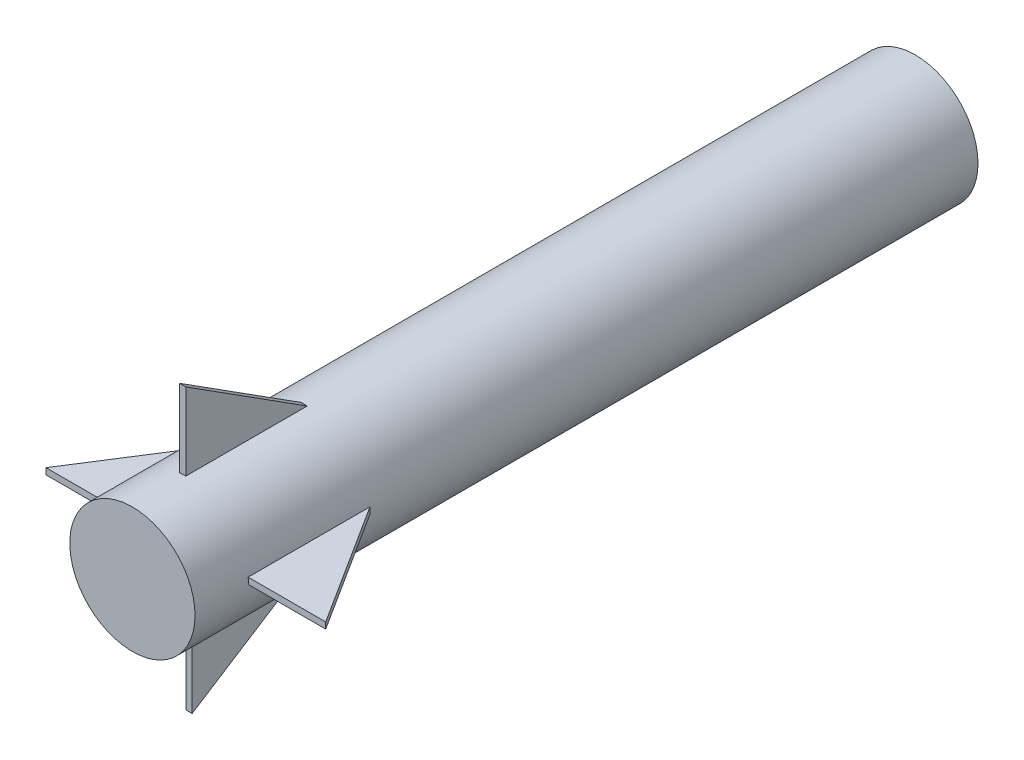
ISO-10303-21;
HEADER;
FILE_DESCRIPTION(('STEP AP214'),'2;1');
FILE_NAME('part.step','',(''),(''),'','','');
FILE_SCHEMA(('AUTOMOTIVE_DESIGN { 1 0 10303 214 1 1 1 1 }'));
ENDSEC;
DATA;
#1=APPLICATION_CONTEXT('core data for automotive mechanical design processes');
#2=APPLICATION_PROTOCOL_DEFINITION('international standard','automotive_design',2000,#1);
#3=PRODUCT_CONTEXT('',#1,'mechanical');
#4=PRODUCT('Part','Part','',(#3));
#5=PRODUCT_RELATED_PRODUCT_CATEGORY('part','',(#4));
#6=PRODUCT_DEFINITION_FORMATION('','',#4);
#7=PRODUCT_DEFINITION_CONTEXT('part definition',#1,'design');
#8=PRODUCT_DEFINITION('design','',#6,#7);
#9=PRODUCT_DEFINITION_SHAPE('','',#8);
#10=(LENGTH_UNIT() NAMED_UNIT(*) SI_UNIT(.MILLI.,.METRE.));
#11=(NAMED_UNIT(*) PLANE_ANGLE_UNIT() SI_UNIT($,.RADIAN.));
#12=(NAMED_UNIT(*) SI_UNIT($,.STERADIAN.) SOLID_ANGLE_UNIT());
#13=UNCERTAINTY_MEASURE_WITH_UNIT(LENGTH_MEASURE(1.E-05),#10,'distance_accuracy_value','');
#14=(GEOMETRIC_REPRESENTATION_CONTEXT(3) GLOBAL_UNCERTAINTY_ASSIGNED_CONTEXT((#13)) GLOBAL_UNIT_ASSIGNED_CONTEXT((#10,
#11,#12)) REPRESENTATION_CONTEXT('',''));
#15=CARTESIAN_POINT('',(0.,0.,0.));
#16=DIRECTION('',(0.,0.,1.));
#17=DIRECTION('',(1.,0.,0.));
#18=AXIS2_PLACEMENT_3D('',#15,#16,#17);
#19=CARTESIAN_POINT('',(0.,0.,1000.));
#20=DIRECTION('',(0.,0.,-1.));
#21=DIRECTION('',(-1.,0.,0.));
#22=AXIS2_PLACEMENT_3D('',#19,#20,#21);
#23=CYLINDRICAL_SURFACE('',#22,80.);
#24=DIRECTION('',(0.,0.,-1.));
#25=VECTOR('',#24,1.);
#26=CARTESIAN_POINT('',(-79.5989949685296,-8.,1000.));
#27=LINE('',#26,#25);
#28=CARTESIAN_POINT('',(-79.5989949685296,-8.,776.139430347805));
#29=VERTEX_POINT('',#28);
#30=CARTESIAN_POINT('',(-79.5989949685296,-8.,931.737875277475));
#31=VERTEX_POINT('',#30);
#32=EDGE_CURVE('E258',#29,#31,#27,.F.);
#33=ORIENTED_EDGE('',*,*,#32,.F.);
#34=CARTESIAN_POINT('',(0.,0.,651.055295397259));
#35=DIRECTION('',(0.843661487732107,0.,0.536875492193159));
#36=DIRECTION('',(0.536875492193159,0.,-0.843661487732107));
#37=AXIS2_PLACEMENT_3D('',#34,#35,#36);
#38=ELLIPSE('',#37,149.010340690346,80.);
#39=CARTESIAN_POINT('',(-80.,0.,776.769581111544));
#40=VERTEX_POINT('',#39);
#41=EDGE_CURVE('E252',#40,#29,#38,.T.);
#42=ORIENTED_EDGE('',*,*,#41,.F.);
#43=DIRECTION('',(0.,0.,-1.));
#44=VECTOR('',#43,1.);
#45=CARTESIAN_POINT('',(-80.,0.,1000.));
#46=LINE('',#45,#44);
#47=CARTESIAN_POINT('',(-80.,0.,931.737875277475));
#48=VERTEX_POINT('',#47);
#49=EDGE_CURVE('E248',#40,#48,#46,.F.);
#50=ORIENTED_EDGE('',*,*,#49,.T.);
#51=CARTESIAN_POINT('',(0.,0.,931.737875277475));
#52=DIRECTION('',(0.,0.,-1.));
#53=DIRECTION('',(-1.,0.,0.));
#54=AXIS2_PLACEMENT_3D('',#51,#52,#53);
#55=CIRCLE('',#54,80.);
#56=EDGE_CURVE('E255',#31,#48,#55,.T.);
#57=ORIENTED_EDGE('',*,*,#56,.F.);
#58=EDGE_LOOP('',(#33,#42,#50,#57));
#59=FACE_BOUND('',#58,.T.);
#60=DIRECTION('',(0.,0.,-1.));
#61=VECTOR('',#60,1.);
#62=CARTESIAN_POINT('',(79.5989949685296,8.,1000.));
#63=LINE('',#62,#61);
#64=CARTESIAN_POINT('',(79.5989949685296,8.,776.139430347805));
#65=VERTEX_POINT('',#64);
#66=CARTESIAN_POINT('',(79.5989949685296,8.,931.737875277475));
#67=VERTEX_POINT('',#66);
#68=EDGE_CURVE('E231',#65,#67,#63,.F.);
#69=ORIENTED_EDGE('',*,*,#68,.F.);
#70=CARTESIAN_POINT('',(0.,0.,651.055295397259));
#71=DIRECTION('',(-0.843661487732107,0.,0.536875492193159));
#72=DIRECTION('',(-0.536875492193159,0.,-0.843661487732107));
#73=AXIS2_PLACEMENT_3D('',#70,#71,#72);
#74=ELLIPSE('',#73,149.010340690346,80.);
#75=CARTESIAN_POINT('',(80.,0.,776.769581111544));
#76=VERTEX_POINT('',#75);
#77=EDGE_CURVE('E224',#76,#65,#74,.T.);
#78=ORIENTED_EDGE('',*,*,#77,.F.);
#79=DIRECTION('',(0.,0.,-1.));
#80=VECTOR('',#79,1.);
#81=CARTESIAN_POINT('',(80.,0.,1000.));
#82=LINE('',#81,#80);
#83=CARTESIAN_POINT('',(80.,0.,931.737875277475));
#84=VERTEX_POINT('',#83);
#85=EDGE_CURVE('E217',#76,#84,#82,.F.);
#86=ORIENTED_EDGE('',*,*,#85,.T.);
#87=CARTESIAN_POINT('',(0.,0.,931.737875277475));
#88=DIRECTION('',(0.,0.,-1.));
#89=DIRECTION('',(-1.,0.,0.));
#90=AXIS2_PLACEMENT_3D('',#87,#88,#89);
#91=CIRCLE('',#90,80.);
#92=EDGE_CURVE('E227',#67,#84,#91,.T.);
#93=ORIENTED_EDGE('',*,*,#92,.F.);
#94=EDGE_LOOP('',(#69,#78,#86,#93));
#95=FACE_BOUND('',#94,.T.);
#96=CARTESIAN_POINT('',(0.,0.,1000.));
#97=DIRECTION('',(0.,0.,1.));
#98=DIRECTION('',(1.,0.,0.));
#99=AXIS2_PLACEMENT_3D('',#96,#97,#98);
#100=CIRCLE('',#99,80.);
#101=CARTESIAN_POINT('',(80.,0.,1000.));
#102=VERTEX_POINT('',#101);
#103=EDGE_CURVE('E213',#102,#102,#100,.T.);
#104=ORIENTED_EDGE('',*,*,#103,.F.);
#105=EDGE_LOOP('',(#104));
#106=FACE_BOUND('',#105,.T.);
#107=CARTESIAN_POINT('',(0.,0.,0.));
#108=DIRECTION('',(0.,0.,1.));
#109=DIRECTION('',(1.,0.,0.));
#110=AXIS2_PLACEMENT_3D('',#107,#108,#109);
#111=CIRCLE('',#110,80.);
#112=CARTESIAN_POINT('',(80.,0.,0.));
#113=VERTEX_POINT('',#112);
#114=EDGE_CURVE('E212',#113,#113,#111,.T.);
#115=ORIENTED_EDGE('',*,*,#114,.T.);
#116=EDGE_LOOP('',(#115));
#117=FACE_BOUND('',#116,.T.);
#118=DIRECTION('',(0.,0.,-1.));
#119=VECTOR('',#118,1.);
#120=CARTESIAN_POINT('',(7.99999999999972,-79.5989949685296,1000.));
#121=LINE('',#120,#119);
#122=CARTESIAN_POINT('',(7.99999999999972,-79.5989949685296,776.139430347805));
#123=VERTEX_POINT('',#122);
#124=CARTESIAN_POINT('',(7.99999999999972,-79.5989949685296,931.737875277475));
#125=VERTEX_POINT('',#124);
#126=EDGE_CURVE('E245',#123,#125,#121,.F.);
#127=ORIENTED_EDGE('',*,*,#126,.F.);
#128=CARTESIAN_POINT('',(0.,0.,651.055295397259));
#129=DIRECTION('',(0.,0.843661487732107,0.536875492193159));
#130=DIRECTION('',(0.,0.536875492193159,-0.843661487732107));
#131=AXIS2_PLACEMENT_3D('',#128,#129,#130);
#132=ELLIPSE('',#131,149.010340690346,80.);
#133=CARTESIAN_POINT('',(-2.79318507107451E-13,-80.,776.769581111544));
#134=VERTEX_POINT('',#133);
#135=EDGE_CURVE('E238',#134,#123,#132,.T.);
#136=ORIENTED_EDGE('',*,*,#135,.F.);
#137=DIRECTION('',(0.,0.,-1.));
#138=VECTOR('',#137,1.);
#139=CARTESIAN_POINT('',(-2.79318507107451E-13,-80.,1000.));
#140=LINE('',#139,#138);
#141=CARTESIAN_POINT('',(-2.79318507107451E-13,-80.,931.737875277475));
#142=VERTEX_POINT('',#141);
#143=EDGE_CURVE('E234',#134,#142,#140,.F.);
#144=ORIENTED_EDGE('',*,*,#143,.T.);
#145=CARTESIAN_POINT('',(0.,0.,931.737875277475));
#146=DIRECTION('',(0.,0.,-1.));
#147=DIRECTION('',(-1.,0.,0.));
#148=AXIS2_PLACEMENT_3D('',#145,#146,#147);
#149=CIRCLE('',#148,80.);
#150=EDGE_CURVE('E241',#125,#142,#149,.T.);
#151=ORIENTED_EDGE('',*,*,#150,.F.);
#152=EDGE_LOOP('',(#127,#136,#144,#151));
#153=FACE_BOUND('',#152,.T.);
#154=DIRECTION('',(0.,0.,-1.));
#155=VECTOR('',#154,1.);
#156=CARTESIAN_POINT('',(-7.99999999999917,79.5989949685297,1000.));
#157=LINE('',#156,#155);
#158=CARTESIAN_POINT('',(-7.99999999999917,79.5989949685297,776.139430347805));
#159=VERTEX_POINT('',#158);
#160=CARTESIAN_POINT('',(-7.99999999999917,79.5989949685297,931.737875277475));
#161=VERTEX_POINT('',#160);
#162=EDGE_CURVE('E11',#159,#161,#157,.F.);
#163=ORIENTED_EDGE('',*,*,#162,.F.);
#164=CARTESIAN_POINT('',(0.,0.,651.055295397259));
#165=DIRECTION('',(0.,-0.843661487732107,0.536875492193159));
#166=DIRECTION('',(0.,-0.536875492193159,-0.843661487732107));
#167=AXIS2_PLACEMENT_3D('',#164,#165,#166);
#168=ELLIPSE('',#167,149.010340690346,80.);
#169=CARTESIAN_POINT('',(8.37955521322352E-13,80.,776.769581111544));
#170=VERTEX_POINT('',#169);
#171=EDGE_CURVE('E151',#170,#159,#168,.T.);
#172=ORIENTED_EDGE('',*,*,#171,.F.);
#173=DIRECTION('',(0.,0.,-1.));
#174=VECTOR('',#173,1.);
#175=CARTESIAN_POINT('',(8.37955521322352E-13,80.,1000.));
#176=LINE('',#175,#174);
#177=CARTESIAN_POINT('',(8.37955521322352E-13,80.,931.737875277475));
#178=VERTEX_POINT('',#177);
#179=EDGE_CURVE('E261',#170,#178,#176,.F.);
#180=ORIENTED_EDGE('',*,*,#179,.T.);
#181=CARTESIAN_POINT('',(0.,0.,931.737875277475));
#182=DIRECTION('',(0.,0.,-1.));
#183=DIRECTION('',(-1.,0.,0.));
#184=AXIS2_PLACEMENT_3D('',#181,#182,#183);
#185=CIRCLE('',#184,80.);
#186=EDGE_CURVE('E51',#161,#178,#185,.T.);
#187=ORIENTED_EDGE('',*,*,#186,.F.);
#188=EDGE_LOOP('',(#163,#172,#180,#187));
#189=FACE_BOUND('',#188,.T.);
#190=ADVANCED_FACE('F43',(#59,#95,#106,#117,#153,#189),#23,.T.);
#191=CARTESIAN_POINT('',(0.,0.,1000.));
#192=DIRECTION('',(0.,0.,1.));
#193=DIRECTION('',(1.,0.,0.));
#194=AXIS2_PLACEMENT_3D('',#191,#192,#193);
#195=PLANE('',#194);
#196=ORIENTED_EDGE('',*,*,#103,.T.);
#197=EDGE_LOOP('',(#196));
#198=FACE_BOUND('',#197,.T.);
#199=ADVANCED_FACE('F280',(#198),#195,.T.);
#200=CARTESIAN_POINT('',(0.,0.,0.));
#201=DIRECTION('',(0.,0.,1.));
#202=DIRECTION('',(1.,0.,0.));
#203=AXIS2_PLACEMENT_3D('',#200,#201,#202);
#204=PLANE('',#203);
#205=ORIENTED_EDGE('',*,*,#114,.F.);
#206=EDGE_LOOP('',(#205));
#207=FACE_BOUND('',#206,.T.);
#208=ADVANCED_FACE('F285',(#207),#204,.F.);
#209=CARTESIAN_POINT('',(0.,8.,0.));
#210=DIRECTION('',(0.,-1.,0.));
#211=DIRECTION('',(0.,0.,-1.));
#212=AXIS2_PLACEMENT_3D('',#209,#210,#211);
#213=PLANE('',#212);
#214=DIRECTION('',(-0.536875492193159,0.,-0.843661487732107));
#215=VECTOR('',#214,1.);
#216=CARTESIAN_POINT('',(73.6161871965014,8.,766.737875277475));
#217=LINE('',#216,#215);
#218=CARTESIAN_POINT('',(178.616187196501,8.,931.737875277475));
#219=VERTEX_POINT('',#218);
#220=EDGE_CURVE('E198',#219,#65,#217,.T.);
#221=ORIENTED_EDGE('',*,*,#220,.T.);
#222=ORIENTED_EDGE('',*,*,#68,.T.);
#223=DIRECTION('',(1.,0.,0.));
#224=VECTOR('',#223,1.);
#225=CARTESIAN_POINT('',(178.616187196501,8.,931.737875277475));
#226=LINE('',#225,#224);
#227=EDGE_CURVE('E195',#67,#219,#226,.T.);
#228=ORIENTED_EDGE('',*,*,#227,.T.);
#229=EDGE_LOOP('',(#221,#222,#228));
#230=FACE_BOUND('',#229,.T.);
#231=ADVANCED_FACE('F329',(#230),#213,.F.);
#232=CARTESIAN_POINT('',(0.,0.,0.));
#233=DIRECTION('',(0.,-1.,0.));
#234=DIRECTION('',(0.,0.,-1.));
#235=AXIS2_PLACEMENT_3D('',#232,#233,#234);
#236=PLANE('',#235);
#237=ORIENTED_EDGE('',*,*,#85,.F.);
#238=DIRECTION('',(-0.536875492193159,0.,-0.843661487732107));
#239=VECTOR('',#238,1.);
#240=CARTESIAN_POINT('',(73.6161871965014,0.,766.737875277475));
#241=LINE('',#240,#239);
#242=CARTESIAN_POINT('',(178.616187196501,0.,931.737875277475));
#243=VERTEX_POINT('',#242);
#244=EDGE_CURVE('E199',#243,#76,#241,.T.);
#245=ORIENTED_EDGE('',*,*,#244,.F.);
#246=DIRECTION('',(1.,0.,0.));
#247=VECTOR('',#246,1.);
#248=CARTESIAN_POINT('',(178.616187196501,0.,931.737875277475));
#249=LINE('',#248,#247);
#250=EDGE_CURVE('E194',#84,#243,#249,.T.);
#251=ORIENTED_EDGE('',*,*,#250,.F.);
#252=EDGE_LOOP('',(#237,#245,#251));
#253=FACE_BOUND('',#252,.T.);
#254=ADVANCED_FACE('F332',(#253),#236,.T.);
#255=CARTESIAN_POINT('',(178.616187196501,8.,931.737875277475));
#256=DIRECTION('',(0.,0.,-1.));
#257=DIRECTION('',(-1.,0.,0.));
#258=AXIS2_PLACEMENT_3D('',#255,#256,#257);
#259=PLANE('',#258);
#260=ORIENTED_EDGE('',*,*,#227,.F.);
#261=ORIENTED_EDGE('',*,*,#92,.T.);
#262=ORIENTED_EDGE('',*,*,#250,.T.);
#263=DIRECTION('',(0.,-1.,0.));
#264=VECTOR('',#263,1.);
#265=CARTESIAN_POINT('',(178.616187196501,8.,931.737875277475));
#266=LINE('',#265,#264);
#267=EDGE_CURVE('E203',#219,#243,#266,.T.);
#268=ORIENTED_EDGE('',*,*,#267,.F.);
#269=EDGE_LOOP('',(#260,#261,#262,#268));
#270=FACE_BOUND('',#269,.T.);
#271=ADVANCED_FACE('F336',(#270),#259,.F.);
#272=CARTESIAN_POINT('',(73.6161871965014,8.,766.737875277475));
#273=DIRECTION('',(-0.843661487732107,0.,0.536875492193159));
#274=DIRECTION('',(0.536875492193159,0.,0.843661487732107));
#275=AXIS2_PLACEMENT_3D('',#272,#273,#274);
#276=PLANE('',#275);
#277=ORIENTED_EDGE('',*,*,#244,.T.);
#278=ORIENTED_EDGE('',*,*,#77,.T.);
#279=ORIENTED_EDGE('',*,*,#220,.F.);
#280=ORIENTED_EDGE('',*,*,#267,.T.);
#281=EDGE_LOOP('',(#277,#278,#279,#280));
#282=FACE_BOUND('',#281,.T.);
#283=ADVANCED_FACE('F322',(#282),#276,.F.);
#284=CARTESIAN_POINT('',(8.,0.,0.));
#285=DIRECTION('',(-1.,0.,0.));
#286=DIRECTION('',(0.,0.,-1.));
#287=AXIS2_PLACEMENT_3D('',#284,#285,#286);
#288=PLANE('',#287);
#289=DIRECTION('',(0.,0.536875492193159,-0.843661487732107));
#290=VECTOR('',#289,1.);
#291=CARTESIAN_POINT('',(7.99999999999974,-73.6161871965014,766.737875277475));
#292=LINE('',#291,#290);
#293=CARTESIAN_POINT('',(7.99999999999938,-178.616187196501,931.737875277475));
#294=VERTEX_POINT('',#293);
#295=EDGE_CURVE('E180',#294,#123,#292,.T.);
#296=ORIENTED_EDGE('',*,*,#295,.T.);
#297=ORIENTED_EDGE('',*,*,#126,.T.);
#298=DIRECTION('',(0.,-1.,0.));
#299=VECTOR('',#298,1.);
#300=CARTESIAN_POINT('',(7.99999999999938,-178.616187196501,931.737875277475));
#301=LINE('',#300,#299);
#302=EDGE_CURVE('E177',#125,#294,#301,.T.);
#303=ORIENTED_EDGE('',*,*,#302,.T.);
#304=EDGE_LOOP('',(#296,#297,#303));
#305=FACE_BOUND('',#304,.T.);
#306=ADVANCED_FACE('F305',(#305),#288,.F.);
#307=CARTESIAN_POINT('',(0.,0.,0.));
#308=DIRECTION('',(-1.,0.,0.));
#309=DIRECTION('',(0.,0.,-1.));
#310=AXIS2_PLACEMENT_3D('',#307,#308,#309);
#311=PLANE('',#310);
#312=ORIENTED_EDGE('',*,*,#143,.F.);
#313=DIRECTION('',(0.,0.536875492193159,-0.843661487732107));
#314=VECTOR('',#313,1.);
#315=CARTESIAN_POINT('',(-2.57029543833367E-13,-73.6161871965014,766.737875277475));
#316=LINE('',#315,#314);
#317=CARTESIAN_POINT('',(-6.23635084411896E-13,-178.616187196501,931.737875277475));
#318=VERTEX_POINT('',#317);
#319=EDGE_CURVE('E181',#318,#134,#316,.T.);
#320=ORIENTED_EDGE('',*,*,#319,.F.);
#321=DIRECTION('',(0.,-1.,0.));
#322=VECTOR('',#321,1.);
#323=CARTESIAN_POINT('',(-6.23635084411896E-13,-178.616187196501,931.737875277475));
#324=LINE('',#323,#322);
#325=EDGE_CURVE('E176',#142,#318,#324,.T.);
#326=ORIENTED_EDGE('',*,*,#325,.F.);
#327=EDGE_LOOP('',(#312,#320,#326));
#328=FACE_BOUND('',#327,.T.);
#329=ADVANCED_FACE('F314',(#328),#311,.T.);
#330=CARTESIAN_POINT('',(7.99999999999938,-178.616187196501,931.737875277475));
#331=DIRECTION('',(0.,0.,-1.));
#332=DIRECTION('',(-1.,0.,0.));
#333=AXIS2_PLACEMENT_3D('',#330,#331,#332);
#334=PLANE('',#333);
#335=ORIENTED_EDGE('',*,*,#302,.F.);
#336=ORIENTED_EDGE('',*,*,#150,.T.);
#337=ORIENTED_EDGE('',*,*,#325,.T.);
#338=DIRECTION('',(-1.,0.,0.));
#339=VECTOR('',#338,1.);
#340=CARTESIAN_POINT('',(7.99999999999938,-178.616187196501,931.737875277475));
#341=LINE('',#340,#339);
#342=EDGE_CURVE('E185',#294,#318,#341,.T.);
#343=ORIENTED_EDGE('',*,*,#342,.F.);
#344=EDGE_LOOP('',(#335,#336,#337,#343));
#345=FACE_BOUND('',#344,.T.);
#346=ADVANCED_FACE('F309',(#345),#334,.F.);
#347=CARTESIAN_POINT('',(7.99999999999974,-73.6161871965014,766.737875277475));
#348=DIRECTION('',(0.,0.843661487732107,0.536875492193159));
#349=DIRECTION('',(0.,-0.536875492193159,0.843661487732107));
#350=AXIS2_PLACEMENT_3D('',#347,#348,#349);
#351=PLANE('',#350);
#352=ORIENTED_EDGE('',*,*,#319,.T.);
#353=ORIENTED_EDGE('',*,*,#135,.T.);
#354=ORIENTED_EDGE('',*,*,#295,.F.);
#355=ORIENTED_EDGE('',*,*,#342,.T.);
#356=EDGE_LOOP('',(#352,#353,#354,#355));
#357=FACE_BOUND('',#356,.T.);
#358=ADVANCED_FACE('F312',(#357),#351,.F.);
#359=CARTESIAN_POINT('',(0.,-8.,0.));
#360=DIRECTION('',(0.,1.,0.));
#361=DIRECTION('',(0.,0.,-1.));
#362=AXIS2_PLACEMENT_3D('',#359,#360,#361);
#363=PLANE('',#362);
#364=DIRECTION('',(0.536875492193159,0.,-0.843661487732107));
#365=VECTOR('',#364,1.);
#366=CARTESIAN_POINT('',(-73.6161871965014,-8.,766.737875277475));
#367=LINE('',#366,#365);
#368=CARTESIAN_POINT('',(-178.616187196501,-8.,931.737875277475));
#369=VERTEX_POINT('',#368);
#370=EDGE_CURVE('E162',#369,#29,#367,.T.);
#371=ORIENTED_EDGE('',*,*,#370,.T.);
#372=ORIENTED_EDGE('',*,*,#32,.T.);
#373=DIRECTION('',(-1.,0.,0.));
#374=VECTOR('',#373,1.);
#375=CARTESIAN_POINT('',(-178.616187196501,-8.,931.737875277475));
#376=LINE('',#375,#374);
#377=EDGE_CURVE('E159',#31,#369,#376,.T.);
#378=ORIENTED_EDGE('',*,*,#377,.T.);
#379=EDGE_LOOP('',(#371,#372,#378));
#380=FACE_BOUND('',#379,.T.);
#381=ADVANCED_FACE('F327',(#380),#363,.F.);
#382=CARTESIAN_POINT('',(0.,0.,0.));
#383=DIRECTION('',(0.,1.,0.));
#384=DIRECTION('',(0.,0.,-1.));
#385=AXIS2_PLACEMENT_3D('',#382,#383,#384);
#386=PLANE('',#385);
#387=ORIENTED_EDGE('',*,*,#49,.F.);
#388=DIRECTION('',(0.536875492193159,0.,-0.843661487732107));
#389=VECTOR('',#388,1.);
#390=CARTESIAN_POINT('',(-73.6161871965014,0.,766.737875277475));
#391=LINE('',#390,#389);
#392=CARTESIAN_POINT('',(-178.616187196501,0.,931.737875277475));
#393=VERTEX_POINT('',#392);
#394=EDGE_CURVE('E163',#393,#40,#391,.T.);
#395=ORIENTED_EDGE('',*,*,#394,.F.);
#396=DIRECTION('',(-1.,0.,0.));
#397=VECTOR('',#396,1.);
#398=CARTESIAN_POINT('',(-178.616187196501,0.,931.737875277475));
#399=LINE('',#398,#397);
#400=EDGE_CURVE('E66',#48,#393,#399,.T.);
#401=ORIENTED_EDGE('',*,*,#400,.F.);
#402=EDGE_LOOP('',(#387,#395,#401));
#403=FACE_BOUND('',#402,.T.);
#404=ADVANCED_FACE('F400',(#403),#386,.T.);
#405=CARTESIAN_POINT('',(-178.616187196501,-8.,931.737875277475));
#406=DIRECTION('',(0.,0.,-1.));
#407=DIRECTION('',(-1.,0.,0.));
#408=AXIS2_PLACEMENT_3D('',#405,#406,#407);
#409=PLANE('',#408);
#410=ORIENTED_EDGE('',*,*,#377,.F.);
#411=ORIENTED_EDGE('',*,*,#56,.T.);
#412=ORIENTED_EDGE('',*,*,#400,.T.);
#413=DIRECTION('',(0.,1.,0.));
#414=VECTOR('',#413,1.);
#415=CARTESIAN_POINT('',(-178.616187196501,-8.,931.737875277475));
#416=LINE('',#415,#414);
#417=EDGE_CURVE('E167',#369,#393,#416,.T.);
#418=ORIENTED_EDGE('',*,*,#417,.F.);
#419=EDGE_LOOP('',(#410,#411,#412,#418));
#420=FACE_BOUND('',#419,.T.);
#421=ADVANCED_FACE('F411',(#420),#409,.F.);
#422=CARTESIAN_POINT('',(-73.6161871965014,-8.,766.737875277475));
#423=DIRECTION('',(0.843661487732107,0.,0.536875492193159));
#424=DIRECTION('',(0.536875492193159,0.,-0.843661487732107));
#425=AXIS2_PLACEMENT_3D('',#422,#423,#424);
#426=PLANE('',#425);
#427=ORIENTED_EDGE('',*,*,#394,.T.);
#428=ORIENTED_EDGE('',*,*,#41,.T.);
#429=ORIENTED_EDGE('',*,*,#370,.F.);
#430=ORIENTED_EDGE('',*,*,#417,.T.);
#431=EDGE_LOOP('',(#427,#428,#429,#430));
#432=FACE_BOUND('',#431,.T.);
#433=ADVANCED_FACE('F276',(#432),#426,.F.);
#434=CARTESIAN_POINT('',(-8.,0.,0.));
#435=DIRECTION('',(1.,0.,0.));
#436=DIRECTION('',(0.,0.,-1.));
#437=AXIS2_PLACEMENT_3D('',#434,#435,#436);
#438=PLANE('',#437);
#439=DIRECTION('',(0.,-0.536875492193159,-0.843661487732107));
#440=VECTOR('',#439,1.);
#441=CARTESIAN_POINT('',(-7.99999999999923,73.6161871965015,766.737875277475));
#442=LINE('',#441,#440);
#443=CARTESIAN_POINT('',(-7.99999999999813,178.616187196501,931.737875277475));
#444=VERTEX_POINT('',#443);
#445=EDGE_CURVE('E135',#444,#159,#442,.T.);
#446=ORIENTED_EDGE('',*,*,#445,.T.);
#447=ORIENTED_EDGE('',*,*,#162,.T.);
#448=DIRECTION('',(0.,1.,0.));
#449=VECTOR('',#448,1.);
#450=CARTESIAN_POINT('',(-7.99999999999813,178.616187196501,931.737875277475));
#451=LINE('',#450,#449);
#452=EDGE_CURVE('E131',#161,#444,#451,.T.);
#453=ORIENTED_EDGE('',*,*,#452,.T.);
#454=EDGE_LOOP('',(#446,#447,#453));
#455=FACE_BOUND('',#454,.T.);
#456=ADVANCED_FACE('F133',(#455),#438,.F.);
#457=CARTESIAN_POINT('',(0.,0.,0.));
#458=DIRECTION('',(1.,0.,0.));
#459=DIRECTION('',(0.,0.,-1.));
#460=AXIS2_PLACEMENT_3D('',#457,#458,#459);
#461=PLANE('',#460);
#462=ORIENTED_EDGE('',*,*,#179,.F.);
#463=DIRECTION('',(0.,-0.536875492193159,-0.843661487732107));
#464=VECTOR('',#463,1.);
#465=CARTESIAN_POINT('',(7.71088631500102E-13,73.6161871965014,766.737875277475));
#466=LINE('',#465,#464);
#467=CARTESIAN_POINT('',(1.87090525323569E-12,178.616187196501,931.737875277475));
#468=VERTEX_POINT('',#467);
#469=EDGE_CURVE('E140',#468,#170,#466,.T.);
#470=ORIENTED_EDGE('',*,*,#469,.F.);
#471=DIRECTION('',(0.,1.,0.));
#472=VECTOR('',#471,1.);
#473=CARTESIAN_POINT('',(1.87090525323569E-12,178.616187196501,931.737875277475));
#474=LINE('',#473,#472);
#475=EDGE_CURVE('E58',#178,#468,#474,.T.);
#476=ORIENTED_EDGE('',*,*,#475,.F.);
#477=EDGE_LOOP('',(#462,#470,#476));
#478=FACE_BOUND('',#477,.T.);
#479=ADVANCED_FACE('F268',(#478),#461,.T.);
#480=CARTESIAN_POINT('',(-7.99999999999813,178.616187196501,931.737875277475));
#481=DIRECTION('',(0.,0.,-1.));
#482=DIRECTION('',(-1.,0.,0.));
#483=AXIS2_PLACEMENT_3D('',#480,#481,#482);
#484=PLANE('',#483);
#485=ORIENTED_EDGE('',*,*,#452,.F.);
#486=ORIENTED_EDGE('',*,*,#186,.T.);
#487=ORIENTED_EDGE('',*,*,#475,.T.);
#488=DIRECTION('',(1.,0.,0.));
#489=VECTOR('',#488,1.);
#490=CARTESIAN_POINT('',(-7.99999999999813,178.616187196501,931.737875277475));
#491=LINE('',#490,#489);
#492=EDGE_CURVE('E143',#444,#468,#491,.T.);
#493=ORIENTED_EDGE('',*,*,#492,.F.);
#494=EDGE_LOOP('',(#485,#486,#487,#493));
#495=FACE_BOUND('',#494,.T.);
#496=ADVANCED_FACE('F144',(#495),#484,.F.);
#497=CARTESIAN_POINT('',(-7.99999999999923,73.6161871965015,766.737875277475));
#498=DIRECTION('',(0.,-0.843661487732107,0.536875492193159));
#499=DIRECTION('',(0.,-0.536875492193159,-0.843661487732107));
#500=AXIS2_PLACEMENT_3D('',#497,#498,#499);
#501=PLANE('',#500);
#502=ORIENTED_EDGE('',*,*,#469,.T.);
#503=ORIENTED_EDGE('',*,*,#171,.T.);
#504=ORIENTED_EDGE('',*,*,#445,.F.);
#505=ORIENTED_EDGE('',*,*,#492,.T.);
#506=EDGE_LOOP('',(#502,#503,#504,#505));
#507=FACE_BOUND('',#506,.T.);
#508=ADVANCED_FACE('F149',(#507),#501,.F.);
#509=CLOSED_SHELL('',(#190,#199,#208,#231,#254,#271,#283,#306,#329,#346,#358,#381,#404,#421,
#433,#456,#479,#496,#508));
#510=MANIFOLD_SOLID_BREP('B2',#509);
#511=ADVANCED_BREP_SHAPE_REPRESENTATION('',(#18,#510),#14);
#512=SHAPE_DEFINITION_REPRESENTATION(#9,#511);
ENDSEC;
END-ISO-10303-21;
